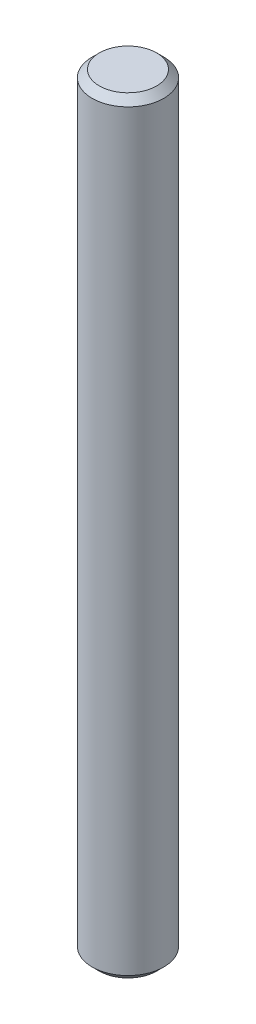
ISO-10303-21;
HEADER;
FILE_DESCRIPTION(('STEP AP214'),'2;1');
FILE_NAME('part.step','',(''),(''),'','','');
FILE_SCHEMA(('AUTOMOTIVE_DESIGN { 1 0 10303 214 1 1 1 1 }'));
ENDSEC;
DATA;
#1=APPLICATION_CONTEXT('core data for automotive mechanical design processes');
#2=APPLICATION_PROTOCOL_DEFINITION('international standard','automotive_design',2000,#1);
#3=PRODUCT_CONTEXT('',#1,'mechanical');
#4=PRODUCT('Part','Part','',(#3));
#5=PRODUCT_RELATED_PRODUCT_CATEGORY('part','',(#4));
#6=PRODUCT_DEFINITION_FORMATION('','',#4);
#7=PRODUCT_DEFINITION_CONTEXT('part definition',#1,'design');
#8=PRODUCT_DEFINITION('design','',#6,#7);
#9=PRODUCT_DEFINITION_SHAPE('','',#8);
#10=(LENGTH_UNIT() NAMED_UNIT(*) SI_UNIT(.MILLI.,.METRE.));
#11=(NAMED_UNIT(*) PLANE_ANGLE_UNIT() SI_UNIT($,.RADIAN.));
#12=(NAMED_UNIT(*) SI_UNIT($,.STERADIAN.) SOLID_ANGLE_UNIT());
#13=UNCERTAINTY_MEASURE_WITH_UNIT(LENGTH_MEASURE(1.E-05),#10,'distance_accuracy_value','');
#14=(GEOMETRIC_REPRESENTATION_CONTEXT(3) GLOBAL_UNCERTAINTY_ASSIGNED_CONTEXT((#13)) GLOBAL_UNIT_ASSIGNED_CONTEXT((#10,
#11,#12)) REPRESENTATION_CONTEXT('',''));
#15=CARTESIAN_POINT('',(0.,0.,0.));
#16=DIRECTION('',(0.,0.,1.));
#17=DIRECTION('',(1.,0.,0.));
#18=AXIS2_PLACEMENT_3D('',#15,#16,#17);
#19=CARTESIAN_POINT('',(0.,53.5,0.));
#20=DIRECTION('',(0.,-1.,0.));
#21=DIRECTION('',(0.,0.,-1.));
#22=AXIS2_PLACEMENT_3D('',#19,#20,#21);
#23=CYLINDRICAL_SURFACE('',#22,2.5);
#24=CARTESIAN_POINT('',(0.,0.499999999999994,0.));
#25=DIRECTION('',(0.,1.,0.));
#26=DIRECTION('',(0.,0.,1.));
#27=AXIS2_PLACEMENT_3D('',#24,#25,#26);
#28=CIRCLE('',#27,2.5);
#29=CARTESIAN_POINT('',(0.,0.499999999999994,2.5));
#30=VERTEX_POINT('',#29);
#31=EDGE_CURVE('E43',#30,#30,#28,.T.);
#32=ORIENTED_EDGE('',*,*,#31,.T.);
#33=EDGE_LOOP('',(#32));
#34=FACE_BOUND('',#33,.T.);
#35=CARTESIAN_POINT('',(0.,53.,0.));
#36=DIRECTION('',(0.,1.,0.));
#37=DIRECTION('',(0.,0.,1.));
#38=AXIS2_PLACEMENT_3D('',#35,#36,#37);
#39=CIRCLE('',#38,2.5);
#40=CARTESIAN_POINT('',(0.,53.,2.5));
#41=VERTEX_POINT('',#40);
#42=EDGE_CURVE('E47',#41,#41,#39,.F.);
#43=ORIENTED_EDGE('',*,*,#42,.T.);
#44=EDGE_LOOP('',(#43));
#45=FACE_BOUND('',#44,.T.);
#46=ADVANCED_FACE('F32',(#34,#45),#23,.T.);
#47=CARTESIAN_POINT('',(0.,53.5,0.));
#48=DIRECTION('',(0.,1.,0.));
#49=DIRECTION('',(0.,0.,1.));
#50=AXIS2_PLACEMENT_3D('',#47,#48,#49);
#51=PLANE('',#50);
#52=CARTESIAN_POINT('',(0.,53.5,0.));
#53=DIRECTION('',(0.,1.,0.));
#54=DIRECTION('',(0.,0.,1.));
#55=AXIS2_PLACEMENT_3D('',#52,#53,#54);
#56=CIRCLE('',#55,1.99999999999999);
#57=CARTESIAN_POINT('',(0.,53.5,1.99999999999999));
#58=VERTEX_POINT('',#57);
#59=EDGE_CURVE('E10',#58,#58,#56,.T.);
#60=ORIENTED_EDGE('',*,*,#59,.T.);
#61=EDGE_LOOP('',(#60));
#62=FACE_BOUND('',#61,.T.);
#63=ADVANCED_FACE('F63',(#62),#51,.T.);
#64=CARTESIAN_POINT('',(0.,0.,0.));
#65=DIRECTION('',(0.,1.,0.));
#66=DIRECTION('',(0.,0.,1.));
#67=AXIS2_PLACEMENT_3D('',#64,#65,#66);
#68=PLANE('',#67);
#69=CARTESIAN_POINT('',(0.,0.,0.));
#70=DIRECTION('',(0.,1.,0.));
#71=DIRECTION('',(0.,0.,1.));
#72=AXIS2_PLACEMENT_3D('',#69,#70,#71);
#73=CIRCLE('',#72,2.);
#74=CARTESIAN_POINT('',(0.,0.,2.));
#75=VERTEX_POINT('',#74);
#76=EDGE_CURVE('E39',#75,#75,#73,.F.);
#77=ORIENTED_EDGE('',*,*,#76,.T.);
#78=EDGE_LOOP('',(#77));
#79=FACE_BOUND('',#78,.T.);
#80=ADVANCED_FACE('F60',(#79),#68,.F.);
#81=CARTESIAN_POINT('',(0.,0.499999999999994,0.));
#82=DIRECTION('',(0.,1.,0.));
#83=DIRECTION('',(0.,0.,1.));
#84=AXIS2_PLACEMENT_3D('',#81,#82,#83);
#85=CONICAL_SURFACE('',#84,2.5,0.785398163397453);
#86=ORIENTED_EDGE('',*,*,#76,.F.);
#87=EDGE_LOOP('',(#86));
#88=FACE_BOUND('',#87,.T.);
#89=ORIENTED_EDGE('',*,*,#31,.F.);
#90=EDGE_LOOP('',(#89));
#91=FACE_BOUND('',#90,.T.);
#92=ADVANCED_FACE('F56',(#88,#91),#85,.T.);
#93=CARTESIAN_POINT('',(0.,53.5,0.));
#94=DIRECTION('',(0.,-1.,0.));
#95=DIRECTION('',(0.,0.,-1.));
#96=AXIS2_PLACEMENT_3D('',#93,#94,#95);
#97=CONICAL_SURFACE('',#96,1.99999999999999,0.785398163397453);
#98=ORIENTED_EDGE('',*,*,#42,.F.);
#99=EDGE_LOOP('',(#98));
#100=FACE_BOUND('',#99,.T.);
#101=ORIENTED_EDGE('',*,*,#59,.F.);
#102=EDGE_LOOP('',(#101));
#103=FACE_BOUND('',#102,.T.);
#104=ADVANCED_FACE('F34',(#100,#103),#97,.T.);
#105=CLOSED_SHELL('',(#46,#63,#80,#92,#104));
#106=MANIFOLD_SOLID_BREP('B2',#105);
#107=ADVANCED_BREP_SHAPE_REPRESENTATION('',(#18,#106),#14);
#108=SHAPE_DEFINITION_REPRESENTATION(#9,#107);
ENDSEC;
END-ISO-10303-21;
